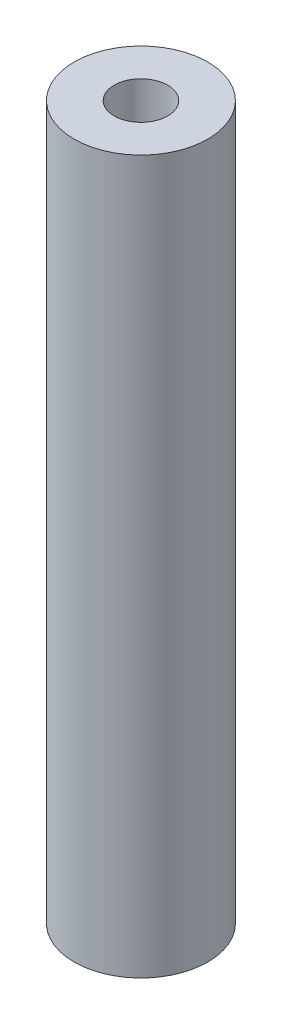
ISO-10303-21;
HEADER;
FILE_DESCRIPTION(('STEP AP214'),'2;1');
FILE_NAME('part.step','',(''),(''),'','','');
FILE_SCHEMA(('AUTOMOTIVE_DESIGN { 1 0 10303 214 1 1 1 1 }'));
ENDSEC;
DATA;
#1=APPLICATION_CONTEXT('core data for automotive mechanical design processes');
#2=APPLICATION_PROTOCOL_DEFINITION('international standard','automotive_design',2000,#1);
#3=PRODUCT_CONTEXT('',#1,'mechanical');
#4=PRODUCT('Part','Part','',(#3));
#5=PRODUCT_RELATED_PRODUCT_CATEGORY('part','',(#4));
#6=PRODUCT_DEFINITION_FORMATION('','',#4);
#7=PRODUCT_DEFINITION_CONTEXT('part definition',#1,'design');
#8=PRODUCT_DEFINITION('design','',#6,#7);
#9=PRODUCT_DEFINITION_SHAPE('','',#8);
#10=(LENGTH_UNIT() NAMED_UNIT(*) SI_UNIT(.MILLI.,.METRE.));
#11=(NAMED_UNIT(*) PLANE_ANGLE_UNIT() SI_UNIT($,.RADIAN.));
#12=(NAMED_UNIT(*) SI_UNIT($,.STERADIAN.) SOLID_ANGLE_UNIT());
#13=UNCERTAINTY_MEASURE_WITH_UNIT(LENGTH_MEASURE(1.E-05),#10,'distance_accuracy_value','');
#14=(GEOMETRIC_REPRESENTATION_CONTEXT(3) GLOBAL_UNCERTAINTY_ASSIGNED_CONTEXT((#13)) GLOBAL_UNIT_ASSIGNED_CONTEXT((#10,
#11,#12)) REPRESENTATION_CONTEXT('',''));
#15=CARTESIAN_POINT('',(0.,0.,0.));
#16=DIRECTION('',(0.,0.,1.));
#17=DIRECTION('',(1.,0.,0.));
#18=AXIS2_PLACEMENT_3D('',#15,#16,#17);
#19=CARTESIAN_POINT('',(0.,80.,0.));
#20=DIRECTION('',(0.,-1.,0.));
#21=DIRECTION('',(0.,0.,-1.));
#22=AXIS2_PLACEMENT_3D('',#19,#20,#21);
#23=CYLINDRICAL_SURFACE('',#22,7.5);
#24=CARTESIAN_POINT('',(0.,80.,0.));
#25=DIRECTION('',(0.,1.,0.));
#26=DIRECTION('',(0.,0.,1.));
#27=AXIS2_PLACEMENT_3D('',#24,#25,#26);
#28=CIRCLE('',#27,7.5);
#29=CARTESIAN_POINT('',(0.,80.,7.5));
#30=VERTEX_POINT('',#29);
#31=EDGE_CURVE('E10',#30,#30,#28,.T.);
#32=ORIENTED_EDGE('',*,*,#31,.F.);
#33=EDGE_LOOP('',(#32));
#34=FACE_BOUND('',#33,.T.);
#35=CARTESIAN_POINT('',(0.,0.,0.));
#36=DIRECTION('',(0.,1.,0.));
#37=DIRECTION('',(0.,0.,1.));
#38=AXIS2_PLACEMENT_3D('',#35,#36,#37);
#39=CIRCLE('',#38,7.5);
#40=CARTESIAN_POINT('',(0.,0.,7.5));
#41=VERTEX_POINT('',#40);
#42=EDGE_CURVE('E37',#41,#41,#39,.T.);
#43=ORIENTED_EDGE('',*,*,#42,.T.);
#44=EDGE_LOOP('',(#43));
#45=FACE_BOUND('',#44,.T.);
#46=ADVANCED_FACE('F34',(#34,#45),#23,.T.);
#47=CARTESIAN_POINT('',(0.,80.,0.));
#48=DIRECTION('',(0.,1.,0.));
#49=DIRECTION('',(0.,0.,1.));
#50=AXIS2_PLACEMENT_3D('',#47,#48,#49);
#51=PLANE('',#50);
#52=CARTESIAN_POINT('',(0.,80.,0.));
#53=DIRECTION('',(0.,1.,0.));
#54=DIRECTION('',(0.,0.,1.));
#55=AXIS2_PLACEMENT_3D('',#52,#53,#54);
#56=CIRCLE('',#55,3.);
#57=CARTESIAN_POINT('',(0.,80.,3.));
#58=VERTEX_POINT('',#57);
#59=EDGE_CURVE('E46',#58,#58,#56,.T.);
#60=ORIENTED_EDGE('',*,*,#59,.F.);
#61=EDGE_LOOP('',(#60));
#62=FACE_BOUND('',#61,.T.);
#63=ORIENTED_EDGE('',*,*,#31,.T.);
#64=EDGE_LOOP('',(#63));
#65=FACE_BOUND('',#64,.T.);
#66=ADVANCED_FACE('F71',(#62,#65),#51,.T.);
#67=CARTESIAN_POINT('',(0.,0.,0.));
#68=DIRECTION('',(0.,1.,0.));
#69=DIRECTION('',(0.,0.,1.));
#70=AXIS2_PLACEMENT_3D('',#67,#68,#69);
#71=PLANE('',#70);
#72=CARTESIAN_POINT('',(0.,0.,0.));
#73=DIRECTION('',(0.,-1.,0.));
#74=DIRECTION('',(0.,0.,-1.));
#75=AXIS2_PLACEMENT_3D('',#72,#73,#74);
#76=CIRCLE('',#75,3.);
#77=CARTESIAN_POINT('',(0.,0.,-3.));
#78=VERTEX_POINT('',#77);
#79=EDGE_CURVE('E52',#78,#78,#76,.T.);
#80=ORIENTED_EDGE('',*,*,#79,.F.);
#81=EDGE_LOOP('',(#80));
#82=FACE_BOUND('',#81,.T.);
#83=ORIENTED_EDGE('',*,*,#42,.F.);
#84=EDGE_LOOP('',(#83));
#85=FACE_BOUND('',#84,.T.);
#86=ADVANCED_FACE('F67',(#82,#85),#71,.F.);
#87=CARTESIAN_POINT('',(0.,60.,0.));
#88=DIRECTION('',(0.,1.,0.));
#89=DIRECTION('',(0.,0.,1.));
#90=AXIS2_PLACEMENT_3D('',#87,#88,#89);
#91=CYLINDRICAL_SURFACE('',#90,3.);
#92=CARTESIAN_POINT('',(0.,60.,0.));
#93=DIRECTION('',(0.,1.,0.));
#94=DIRECTION('',(0.,0.,1.));
#95=AXIS2_PLACEMENT_3D('',#92,#93,#94);
#96=CIRCLE('',#95,3.);
#97=CARTESIAN_POINT('',(0.,60.,3.));
#98=VERTEX_POINT('',#97);
#99=EDGE_CURVE('E44',#98,#98,#96,.T.);
#100=ORIENTED_EDGE('',*,*,#99,.F.);
#101=EDGE_LOOP('',(#100));
#102=FACE_BOUND('',#101,.T.);
#103=ORIENTED_EDGE('',*,*,#59,.T.);
#104=EDGE_LOOP('',(#103));
#105=FACE_BOUND('',#104,.T.);
#106=ADVANCED_FACE('F70',(#102,#105),#91,.F.);
#107=CARTESIAN_POINT('',(0.,60.,0.));
#108=DIRECTION('',(0.,1.,0.));
#109=DIRECTION('',(0.,0.,1.));
#110=AXIS2_PLACEMENT_3D('',#107,#108,#109);
#111=PLANE('',#110);
#112=ORIENTED_EDGE('',*,*,#99,.T.);
#113=EDGE_LOOP('',(#112));
#114=FACE_BOUND('',#113,.T.);
#115=ADVANCED_FACE('F63',(#114),#111,.T.);
#116=CARTESIAN_POINT('',(0.,20.,0.));
#117=DIRECTION('',(0.,-1.,0.));
#118=DIRECTION('',(0.,0.,-1.));
#119=AXIS2_PLACEMENT_3D('',#116,#117,#118);
#120=CYLINDRICAL_SURFACE('',#119,3.);
#121=CARTESIAN_POINT('',(0.,20.,0.));
#122=DIRECTION('',(0.,-1.,0.));
#123=DIRECTION('',(0.,0.,-1.));
#124=AXIS2_PLACEMENT_3D('',#121,#122,#123);
#125=CIRCLE('',#124,3.);
#126=CARTESIAN_POINT('',(0.,20.,-3.));
#127=VERTEX_POINT('',#126);
#128=EDGE_CURVE('E49',#127,#127,#125,.T.);
#129=ORIENTED_EDGE('',*,*,#128,.F.);
#130=EDGE_LOOP('',(#129));
#131=FACE_BOUND('',#130,.T.);
#132=ORIENTED_EDGE('',*,*,#79,.T.);
#133=EDGE_LOOP('',(#132));
#134=FACE_BOUND('',#133,.T.);
#135=ADVANCED_FACE('F60',(#131,#134),#120,.F.);
#136=CARTESIAN_POINT('',(0.,20.,0.));
#137=DIRECTION('',(0.,-1.,0.));
#138=DIRECTION('',(0.,0.,-1.));
#139=AXIS2_PLACEMENT_3D('',#136,#137,#138);
#140=PLANE('',#139);
#141=ORIENTED_EDGE('',*,*,#128,.T.);
#142=EDGE_LOOP('',(#141));
#143=FACE_BOUND('',#142,.T.);
#144=ADVANCED_FACE('F58',(#143),#140,.T.);
#145=CLOSED_SHELL('',(#46,#66,#86,#106,#115,#135,#144));
#146=MANIFOLD_SOLID_BREP('B2',#145);
#147=ADVANCED_BREP_SHAPE_REPRESENTATION('',(#18,#146),#14);
#148=SHAPE_DEFINITION_REPRESENTATION(#9,#147);
ENDSEC;
END-ISO-10303-21;
